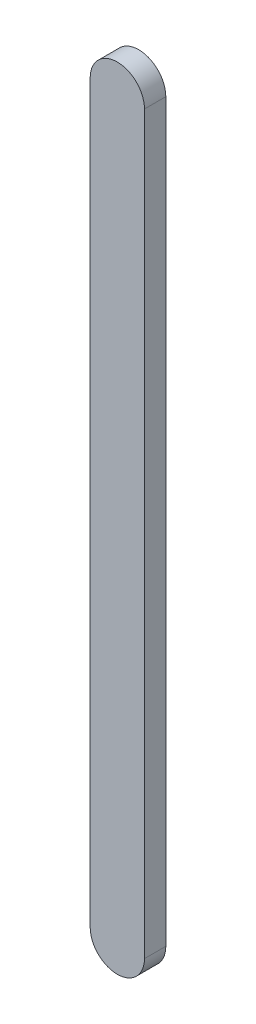
ISO-10303-21;
HEADER;
FILE_DESCRIPTION(('STEP AP214'),'2;1');
FILE_NAME('part.step','',(''),(''),'','','');
FILE_SCHEMA(('AUTOMOTIVE_DESIGN { 1 0 10303 214 1 1 1 1 }'));
ENDSEC;
DATA;
#1=APPLICATION_CONTEXT('core data for automotive mechanical design processes');
#2=APPLICATION_PROTOCOL_DEFINITION('international standard','automotive_design',2000,#1);
#3=PRODUCT_CONTEXT('',#1,'mechanical');
#4=PRODUCT('Part','Part','',(#3));
#5=PRODUCT_RELATED_PRODUCT_CATEGORY('part','',(#4));
#6=PRODUCT_DEFINITION_FORMATION('','',#4);
#7=PRODUCT_DEFINITION_CONTEXT('part definition',#1,'design');
#8=PRODUCT_DEFINITION('design','',#6,#7);
#9=PRODUCT_DEFINITION_SHAPE('','',#8);
#10=(LENGTH_UNIT() NAMED_UNIT(*) SI_UNIT(.MILLI.,.METRE.));
#11=(NAMED_UNIT(*) PLANE_ANGLE_UNIT() SI_UNIT($,.RADIAN.));
#12=(NAMED_UNIT(*) SI_UNIT($,.STERADIAN.) SOLID_ANGLE_UNIT());
#13=UNCERTAINTY_MEASURE_WITH_UNIT(LENGTH_MEASURE(1.E-05),#10,'distance_accuracy_value','');
#14=(GEOMETRIC_REPRESENTATION_CONTEXT(3) GLOBAL_UNCERTAINTY_ASSIGNED_CONTEXT((#13)) GLOBAL_UNIT_ASSIGNED_CONTEXT((#10,
#11,#12)) REPRESENTATION_CONTEXT('',''));
#15=CARTESIAN_POINT('',(0.,0.,0.));
#16=DIRECTION('',(0.,0.,1.));
#17=DIRECTION('',(1.,0.,0.));
#18=AXIS2_PLACEMENT_3D('',#15,#16,#17);
#19=CARTESIAN_POINT('',(127.5331968,110.5845388,0.));
#20=DIRECTION('',(-1.,0.,0.));
#21=DIRECTION('',(0.,1.,0.));
#22=AXIS2_PLACEMENT_3D('',#19,#20,#21);
#23=PLANE('',#22);
#24=DIRECTION('',(0.,1.,0.));
#25=VECTOR('',#24,1.);
#26=CARTESIAN_POINT('',(127.5331968,110.5845388,0.1999996));
#27=LINE('',#26,#25);
#28=CARTESIAN_POINT('',(127.5331968,110.5845388,0.1999996));
#29=VERTEX_POINT('',#28);
#30=CARTESIAN_POINT('',(127.5331968,117.475,0.1999996));
#31=VERTEX_POINT('',#30);
#32=EDGE_CURVE('E11',#29,#31,#27,.T.);
#33=ORIENTED_EDGE('',*,*,#32,.F.);
#34=DIRECTION('',(0.,0.,1.));
#35=VECTOR('',#34,1.);
#36=CARTESIAN_POINT('',(127.5331968,110.5845388,0.));
#37=LINE('',#36,#35);
#38=CARTESIAN_POINT('',(127.5331968,110.5845388,0.));
#39=VERTEX_POINT('',#38);
#40=EDGE_CURVE('E24',#39,#29,#37,.T.);
#41=ORIENTED_EDGE('',*,*,#40,.F.);
#42=DIRECTION('',(0.,1.,0.));
#43=VECTOR('',#42,1.);
#44=CARTESIAN_POINT('',(127.5331968,110.5845388,0.));
#45=LINE('',#44,#43);
#46=CARTESIAN_POINT('',(127.5331968,117.475,0.));
#47=VERTEX_POINT('',#46);
#48=EDGE_CURVE('E75',#39,#47,#45,.T.);
#49=ORIENTED_EDGE('',*,*,#48,.T.);
#50=DIRECTION('',(0.,0.,1.));
#51=VECTOR('',#50,1.);
#52=CARTESIAN_POINT('',(127.5331968,117.475,0.));
#53=LINE('',#52,#51);
#54=EDGE_CURVE('E37',#47,#31,#53,.T.);
#55=ORIENTED_EDGE('',*,*,#54,.T.);
#56=EDGE_LOOP('',(#33,#41,#49,#55));
#57=FACE_BOUND('',#56,.T.);
#58=ADVANCED_FACE('F17',(#57),#23,.F.);
#59=CARTESIAN_POINT('',(127.2791968,117.475,0.));
#60=DIRECTION('',(0.,0.,-1.));
#61=DIRECTION('',(1.,0.,0.));
#62=AXIS2_PLACEMENT_3D('',#59,#60,#61);
#63=CYLINDRICAL_SURFACE('',#62,0.253999999999995);
#64=CARTESIAN_POINT('',(127.2791968,117.475,0.1999996));
#65=DIRECTION('',(0.,0.,1.));
#66=DIRECTION('',(1.,0.,0.));
#67=AXIS2_PLACEMENT_3D('',#64,#65,#66);
#68=CIRCLE('',#67,0.253999999999995);
#69=CARTESIAN_POINT('',(127.0251968,117.475,0.1999996));
#70=VERTEX_POINT('',#69);
#71=EDGE_CURVE('E83',#31,#70,#68,.T.);
#72=ORIENTED_EDGE('',*,*,#71,.F.);
#73=ORIENTED_EDGE('',*,*,#54,.F.);
#74=CARTESIAN_POINT('',(127.2791968,117.475,0.));
#75=DIRECTION('',(0.,0.,1.));
#76=DIRECTION('',(1.,0.,0.));
#77=AXIS2_PLACEMENT_3D('',#74,#75,#76);
#78=CIRCLE('',#77,0.253999999999995);
#79=CARTESIAN_POINT('',(127.0251968,117.475,0.));
#80=VERTEX_POINT('',#79);
#81=EDGE_CURVE('E81',#47,#80,#78,.T.);
#82=ORIENTED_EDGE('',*,*,#81,.T.);
#83=DIRECTION('',(0.,0.,1.));
#84=VECTOR('',#83,1.);
#85=CARTESIAN_POINT('',(127.0251968,117.475,0.));
#86=LINE('',#85,#84);
#87=EDGE_CURVE('E67',#80,#70,#86,.T.);
#88=ORIENTED_EDGE('',*,*,#87,.T.);
#89=EDGE_LOOP('',(#72,#73,#82,#88));
#90=FACE_BOUND('',#89,.T.);
#91=ADVANCED_FACE('F89',(#90),#63,.T.);
#92=CARTESIAN_POINT('',(127.0251968,117.475,0.));
#93=DIRECTION('',(1.,0.,0.));
#94=DIRECTION('',(0.,-1.,0.));
#95=AXIS2_PLACEMENT_3D('',#92,#93,#94);
#96=PLANE('',#95);
#97=DIRECTION('',(0.,-1.,0.));
#98=VECTOR('',#97,1.);
#99=CARTESIAN_POINT('',(127.0251968,117.475,0.1999996));
#100=LINE('',#99,#98);
#101=CARTESIAN_POINT('',(127.0251968,110.5845388,0.1999996));
#102=VERTEX_POINT('',#101);
#103=EDGE_CURVE('E71',#70,#102,#100,.T.);
#104=ORIENTED_EDGE('',*,*,#103,.F.);
#105=ORIENTED_EDGE('',*,*,#87,.F.);
#106=DIRECTION('',(0.,-1.,0.));
#107=VECTOR('',#106,1.);
#108=CARTESIAN_POINT('',(127.0251968,117.475,0.));
#109=LINE('',#108,#107);
#110=CARTESIAN_POINT('',(127.0251968,110.5845388,0.));
#111=VERTEX_POINT('',#110);
#112=EDGE_CURVE('E63',#80,#111,#109,.T.);
#113=ORIENTED_EDGE('',*,*,#112,.T.);
#114=DIRECTION('',(0.,0.,1.));
#115=VECTOR('',#114,1.);
#116=CARTESIAN_POINT('',(127.0251968,110.5845388,0.));
#117=LINE('',#116,#115);
#118=EDGE_CURVE('E53',#111,#102,#117,.T.);
#119=ORIENTED_EDGE('',*,*,#118,.T.);
#120=EDGE_LOOP('',(#104,#105,#113,#119));
#121=FACE_BOUND('',#120,.T.);
#122=ADVANCED_FACE('F66',(#121),#96,.F.);
#123=CARTESIAN_POINT('',(127.2791968,110.5845388,0.));
#124=DIRECTION('',(0.,0.,-1.));
#125=DIRECTION('',(-1.,0.,0.));
#126=AXIS2_PLACEMENT_3D('',#123,#124,#125);
#127=CYLINDRICAL_SURFACE('',#126,0.254);
#128=CARTESIAN_POINT('',(127.2791968,110.5845388,0.1999996));
#129=DIRECTION('',(0.,0.,1.));
#130=DIRECTION('',(-1.,0.,0.));
#131=AXIS2_PLACEMENT_3D('',#128,#129,#130);
#132=CIRCLE('',#131,0.254);
#133=EDGE_CURVE('E59',#102,#29,#132,.T.);
#134=ORIENTED_EDGE('',*,*,#133,.F.);
#135=ORIENTED_EDGE('',*,*,#118,.F.);
#136=CARTESIAN_POINT('',(127.2791968,110.5845388,0.));
#137=DIRECTION('',(0.,0.,1.));
#138=DIRECTION('',(-1.,0.,0.));
#139=AXIS2_PLACEMENT_3D('',#136,#137,#138);
#140=CIRCLE('',#139,0.254);
#141=EDGE_CURVE('E57',#111,#39,#140,.T.);
#142=ORIENTED_EDGE('',*,*,#141,.T.);
#143=ORIENTED_EDGE('',*,*,#40,.T.);
#144=EDGE_LOOP('',(#134,#135,#142,#143));
#145=FACE_BOUND('',#144,.T.);
#146=ADVANCED_FACE('F55',(#145),#127,.T.);
#147=CARTESIAN_POINT('',(127.5331968,110.5845388,0.));
#148=DIRECTION('',(0.,0.,-1.));
#149=DIRECTION('',(-1.,0.,0.));
#150=AXIS2_PLACEMENT_3D('',#147,#148,#149);
#151=PLANE('',#150);
#152=ORIENTED_EDGE('',*,*,#141,.F.);
#153=ORIENTED_EDGE('',*,*,#112,.F.);
#154=ORIENTED_EDGE('',*,*,#81,.F.);
#155=ORIENTED_EDGE('',*,*,#48,.F.);
#156=EDGE_LOOP('',(#152,#153,#154,#155));
#157=FACE_BOUND('',#156,.T.);
#158=ADVANCED_FACE('F74',(#157),#151,.T.);
#159=CARTESIAN_POINT('',(127.5331968,110.5845388,0.1999996));
#160=DIRECTION('',(0.,0.,-1.));
#161=DIRECTION('',(-1.,0.,0.));
#162=AXIS2_PLACEMENT_3D('',#159,#160,#161);
#163=PLANE('',#162);
#164=ORIENTED_EDGE('',*,*,#32,.T.);
#165=ORIENTED_EDGE('',*,*,#71,.T.);
#166=ORIENTED_EDGE('',*,*,#103,.T.);
#167=ORIENTED_EDGE('',*,*,#133,.T.);
#168=EDGE_LOOP('',(#164,#165,#166,#167));
#169=FACE_BOUND('',#168,.T.);
#170=ADVANCED_FACE('F91',(#169),#163,.F.);
#171=CLOSED_SHELL('',(#58,#91,#122,#146,#158,#170));
#172=MANIFOLD_SOLID_BREP('B1',#171);
#173=ADVANCED_BREP_SHAPE_REPRESENTATION('',(#18,#172),#14);
#174=SHAPE_DEFINITION_REPRESENTATION(#9,#173);
ENDSEC;
END-ISO-10303-21;
